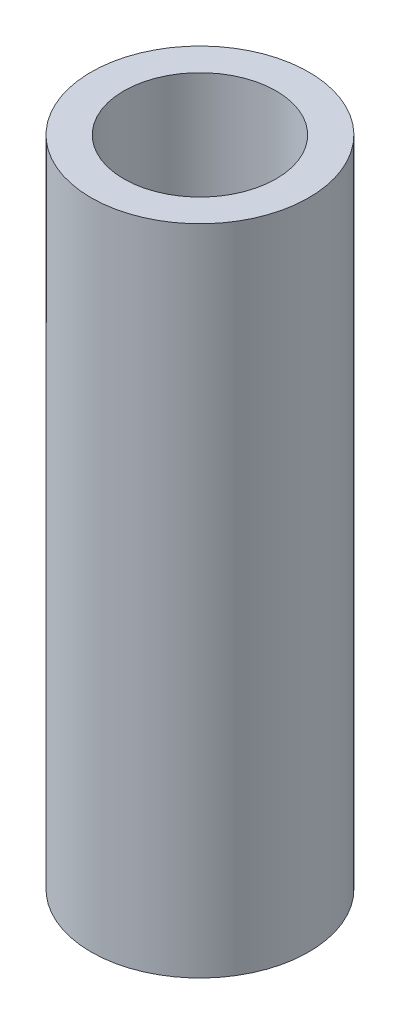
ISO-10303-21;
HEADER;
FILE_DESCRIPTION(('STEP AP214'),'2;1');
FILE_NAME('part.step','',(''),(''),'','','');
FILE_SCHEMA(('AUTOMOTIVE_DESIGN { 1 0 10303 214 1 1 1 1 }'));
ENDSEC;
DATA;
#1=APPLICATION_CONTEXT('core data for automotive mechanical design processes');
#2=APPLICATION_PROTOCOL_DEFINITION('international standard','automotive_design',2000,#1);
#3=PRODUCT_CONTEXT('',#1,'mechanical');
#4=PRODUCT('Part','Part','',(#3));
#5=PRODUCT_RELATED_PRODUCT_CATEGORY('part','',(#4));
#6=PRODUCT_DEFINITION_FORMATION('','',#4);
#7=PRODUCT_DEFINITION_CONTEXT('part definition',#1,'design');
#8=PRODUCT_DEFINITION('design','',#6,#7);
#9=PRODUCT_DEFINITION_SHAPE('','',#8);
#10=(LENGTH_UNIT() NAMED_UNIT(*) SI_UNIT(.MILLI.,.METRE.));
#11=(NAMED_UNIT(*) PLANE_ANGLE_UNIT() SI_UNIT($,.RADIAN.));
#12=(NAMED_UNIT(*) SI_UNIT($,.STERADIAN.) SOLID_ANGLE_UNIT());
#13=UNCERTAINTY_MEASURE_WITH_UNIT(LENGTH_MEASURE(1.E-05),#10,'distance_accuracy_value','');
#14=(GEOMETRIC_REPRESENTATION_CONTEXT(3) GLOBAL_UNCERTAINTY_ASSIGNED_CONTEXT((#13)) GLOBAL_UNIT_ASSIGNED_CONTEXT((#10,
#11,#12)) REPRESENTATION_CONTEXT('',''));
#15=CARTESIAN_POINT('',(0.,0.,0.));
#16=DIRECTION('',(0.,0.,1.));
#17=DIRECTION('',(1.,0.,0.));
#18=AXIS2_PLACEMENT_3D('',#15,#16,#17);
#19=CARTESIAN_POINT('',(0.,15.,0.));
#20=DIRECTION('',(0.,1.,0.));
#21=DIRECTION('',(0.,0.,1.));
#22=AXIS2_PLACEMENT_3D('',#19,#20,#21);
#23=PLANE('',#22);
#24=CARTESIAN_POINT('',(0.,15.,0.));
#25=DIRECTION('',(0.,1.,0.));
#26=DIRECTION('',(0.,0.,1.));
#27=AXIS2_PLACEMENT_3D('',#24,#25,#26);
#28=CIRCLE('',#27,2.5);
#29=CARTESIAN_POINT('',(0.,15.,2.5));
#30=VERTEX_POINT('',#29);
#31=EDGE_CURVE('E10',#30,#30,#28,.T.);
#32=ORIENTED_EDGE('',*,*,#31,.T.);
#33=EDGE_LOOP('',(#32));
#34=FACE_BOUND('',#33,.T.);
#35=CARTESIAN_POINT('',(0.,15.,0.));
#36=DIRECTION('',(0.,1.,0.));
#37=DIRECTION('',(0.,0.,1.));
#38=AXIS2_PLACEMENT_3D('',#35,#36,#37);
#39=CIRCLE('',#38,1.75);
#40=CARTESIAN_POINT('',(0.,15.,1.75));
#41=VERTEX_POINT('',#40);
#42=EDGE_CURVE('E50',#41,#41,#39,.T.);
#43=ORIENTED_EDGE('',*,*,#42,.F.);
#44=EDGE_LOOP('',(#43));
#45=FACE_BOUND('',#44,.T.);
#46=ADVANCED_FACE('F37',(#34,#45),#23,.T.);
#47=CARTESIAN_POINT('',(0.,0.,0.));
#48=DIRECTION('',(0.,1.,0.));
#49=DIRECTION('',(0.,0.,1.));
#50=AXIS2_PLACEMENT_3D('',#47,#48,#49);
#51=PLANE('',#50);
#52=CARTESIAN_POINT('',(0.,0.,0.));
#53=DIRECTION('',(0.,1.,0.));
#54=DIRECTION('',(0.,0.,1.));
#55=AXIS2_PLACEMENT_3D('',#52,#53,#54);
#56=CIRCLE('',#55,2.5);
#57=CARTESIAN_POINT('',(0.,0.,2.5));
#58=VERTEX_POINT('',#57);
#59=EDGE_CURVE('E41',#58,#58,#56,.T.);
#60=ORIENTED_EDGE('',*,*,#59,.F.);
#61=EDGE_LOOP('',(#60));
#62=FACE_BOUND('',#61,.T.);
#63=CARTESIAN_POINT('',(0.,0.,0.));
#64=DIRECTION('',(0.,1.,0.));
#65=DIRECTION('',(0.,0.,1.));
#66=AXIS2_PLACEMENT_3D('',#63,#64,#65);
#67=CIRCLE('',#66,1.75);
#68=CARTESIAN_POINT('',(0.,0.,1.75));
#69=VERTEX_POINT('',#68);
#70=EDGE_CURVE('E52',#69,#69,#67,.T.);
#71=ORIENTED_EDGE('',*,*,#70,.T.);
#72=EDGE_LOOP('',(#71));
#73=FACE_BOUND('',#72,.T.);
#74=ADVANCED_FACE('F64',(#62,#73),#51,.F.);
#75=CARTESIAN_POINT('',(0.,15.,0.));
#76=DIRECTION('',(0.,-1.,0.));
#77=DIRECTION('',(0.,0.,-1.));
#78=AXIS2_PLACEMENT_3D('',#75,#76,#77);
#79=CYLINDRICAL_SURFACE('',#78,2.5);
#80=ORIENTED_EDGE('',*,*,#31,.F.);
#81=EDGE_LOOP('',(#80));
#82=FACE_BOUND('',#81,.T.);
#83=ORIENTED_EDGE('',*,*,#59,.T.);
#84=EDGE_LOOP('',(#83));
#85=FACE_BOUND('',#84,.T.);
#86=ADVANCED_FACE('F39',(#82,#85),#79,.T.);
#87=CARTESIAN_POINT('',(0.,15.,0.));
#88=DIRECTION('',(0.,-1.,0.));
#89=DIRECTION('',(0.,0.,-1.));
#90=AXIS2_PLACEMENT_3D('',#87,#88,#89);
#91=CYLINDRICAL_SURFACE('',#90,1.75);
#92=ORIENTED_EDGE('',*,*,#42,.T.);
#93=EDGE_LOOP('',(#92));
#94=FACE_BOUND('',#93,.T.);
#95=ORIENTED_EDGE('',*,*,#70,.F.);
#96=EDGE_LOOP('',(#95));
#97=FACE_BOUND('',#96,.T.);
#98=ADVANCED_FACE('F60',(#94,#97),#91,.F.);
#99=CLOSED_SHELL('',(#46,#74,#86,#98));
#100=MANIFOLD_SOLID_BREP('B2',#99);
#101=ADVANCED_BREP_SHAPE_REPRESENTATION('',(#18,#100),#14);
#102=SHAPE_DEFINITION_REPRESENTATION(#9,#101);
ENDSEC;
END-ISO-10303-21;
